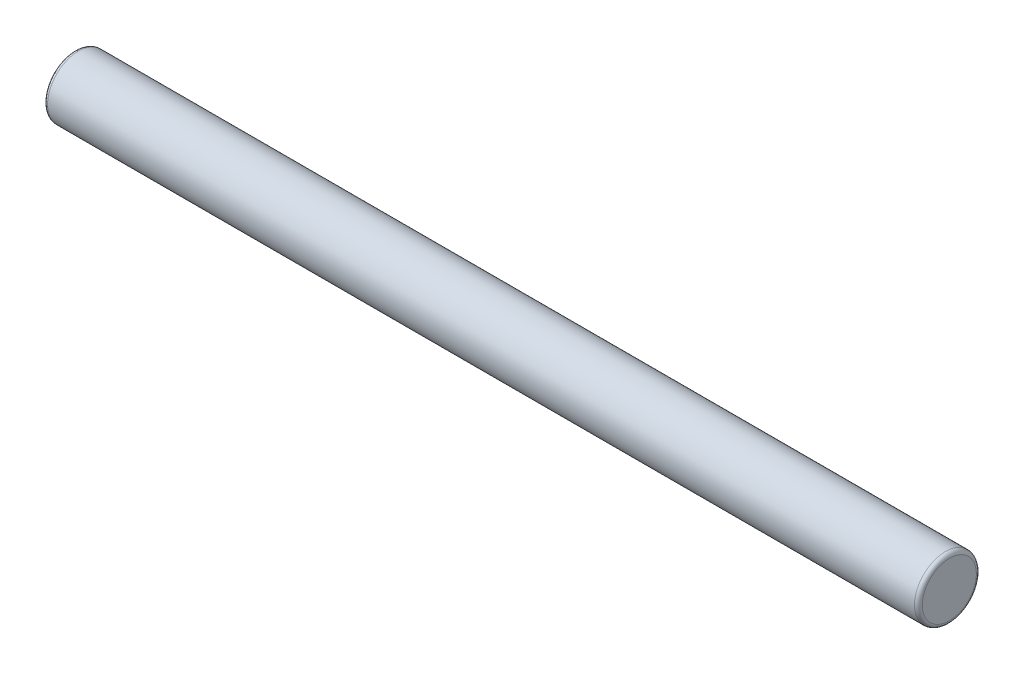
ISO-10303-21;
HEADER;
FILE_DESCRIPTION(('STEP AP214'),'2;1');
FILE_NAME('part.step','',(''),(''),'','','');
FILE_SCHEMA(('AUTOMOTIVE_DESIGN { 1 0 10303 214 1 1 1 1 }'));
ENDSEC;
DATA;
#1=APPLICATION_CONTEXT('core data for automotive mechanical design processes');
#2=APPLICATION_PROTOCOL_DEFINITION('international standard','automotive_design',2000,#1);
#3=PRODUCT_CONTEXT('',#1,'mechanical');
#4=PRODUCT('Part','Part','',(#3));
#5=PRODUCT_RELATED_PRODUCT_CATEGORY('part','',(#4));
#6=PRODUCT_DEFINITION_FORMATION('','',#4);
#7=PRODUCT_DEFINITION_CONTEXT('part definition',#1,'design');
#8=PRODUCT_DEFINITION('design','',#6,#7);
#9=PRODUCT_DEFINITION_SHAPE('','',#8);
#10=(LENGTH_UNIT() NAMED_UNIT(*) SI_UNIT(.MILLI.,.METRE.));
#11=(NAMED_UNIT(*) PLANE_ANGLE_UNIT() SI_UNIT($,.RADIAN.));
#12=(NAMED_UNIT(*) SI_UNIT($,.STERADIAN.) SOLID_ANGLE_UNIT());
#13=UNCERTAINTY_MEASURE_WITH_UNIT(LENGTH_MEASURE(1.E-05),#10,'distance_accuracy_value','');
#14=(GEOMETRIC_REPRESENTATION_CONTEXT(3) GLOBAL_UNCERTAINTY_ASSIGNED_CONTEXT((#13)) GLOBAL_UNIT_ASSIGNED_CONTEXT((#10,
#11,#12)) REPRESENTATION_CONTEXT('',''));
#15=CARTESIAN_POINT('',(0.,0.,0.));
#16=DIRECTION('',(0.,0.,1.));
#17=DIRECTION('',(1.,0.,0.));
#18=AXIS2_PLACEMENT_3D('',#15,#16,#17);
#19=CARTESIAN_POINT('',(113.,0.,0.));
#20=DIRECTION('',(-1.,0.,0.));
#21=DIRECTION('',(0.,0.,1.));
#22=AXIS2_PLACEMENT_3D('',#19,#20,#21);
#23=CYLINDRICAL_SURFACE('',#22,4.);
#24=CARTESIAN_POINT('',(112.492,0.,0.));
#25=DIRECTION('',(1.,0.,0.));
#26=DIRECTION('',(0.,0.,-1.));
#27=AXIS2_PLACEMENT_3D('',#24,#25,#26);
#28=CIRCLE('',#27,4.);
#29=CARTESIAN_POINT('',(112.492,0.,-4.));
#30=VERTEX_POINT('',#29);
#31=EDGE_CURVE('E38',#30,#30,#28,.F.);
#32=ORIENTED_EDGE('',*,*,#31,.T.);
#33=EDGE_LOOP('',(#32));
#34=FACE_BOUND('',#33,.T.);
#35=CARTESIAN_POINT('',(0.507999999999995,0.,0.));
#36=DIRECTION('',(1.,0.,0.));
#37=DIRECTION('',(0.,0.,-1.));
#38=AXIS2_PLACEMENT_3D('',#35,#36,#37);
#39=CIRCLE('',#38,4.);
#40=CARTESIAN_POINT('',(0.507999999999995,0.,-4.));
#41=VERTEX_POINT('',#40);
#42=EDGE_CURVE('E42',#41,#41,#39,.T.);
#43=ORIENTED_EDGE('',*,*,#42,.T.);
#44=EDGE_LOOP('',(#43));
#45=FACE_BOUND('',#44,.T.);
#46=ADVANCED_FACE('F31',(#34,#45),#23,.T.);
#47=CARTESIAN_POINT('',(113.,0.,0.));
#48=DIRECTION('',(1.,0.,0.));
#49=DIRECTION('',(0.,0.,-1.));
#50=AXIS2_PLACEMENT_3D('',#47,#48,#49);
#51=PLANE('',#50);
#52=CARTESIAN_POINT('',(113.,0.,0.));
#53=DIRECTION('',(1.,0.,0.));
#54=DIRECTION('',(0.,0.,-1.));
#55=AXIS2_PLACEMENT_3D('',#52,#53,#54);
#56=CIRCLE('',#55,3.492);
#57=CARTESIAN_POINT('',(113.,0.,-3.492));
#58=VERTEX_POINT('',#57);
#59=EDGE_CURVE('E46',#58,#58,#56,.T.);
#60=ORIENTED_EDGE('',*,*,#59,.T.);
#61=EDGE_LOOP('',(#60));
#62=FACE_BOUND('',#61,.T.);
#63=ADVANCED_FACE('F52',(#62),#51,.T.);
#64=CARTESIAN_POINT('',(0.,0.,0.));
#65=DIRECTION('',(1.,0.,0.));
#66=DIRECTION('',(0.,0.,-1.));
#67=AXIS2_PLACEMENT_3D('',#64,#65,#66);
#68=PLANE('',#67);
#69=CARTESIAN_POINT('',(0.,0.,0.));
#70=DIRECTION('',(1.,0.,0.));
#71=DIRECTION('',(0.,0.,-1.));
#72=AXIS2_PLACEMENT_3D('',#69,#70,#71);
#73=CIRCLE('',#72,3.492);
#74=CARTESIAN_POINT('',(0.,0.,-3.492));
#75=VERTEX_POINT('',#74);
#76=EDGE_CURVE('E10',#75,#75,#73,.F.);
#77=ORIENTED_EDGE('',*,*,#76,.T.);
#78=EDGE_LOOP('',(#77));
#79=FACE_BOUND('',#78,.T.);
#80=ADVANCED_FACE('F56',(#79),#68,.F.);
#81=CARTESIAN_POINT('',(112.492,0.,0.));
#82=DIRECTION('',(1.,0.,0.));
#83=DIRECTION('',(0.,0.,-1.));
#84=AXIS2_PLACEMENT_3D('',#81,#82,#83);
#85=TOROIDAL_SURFACE('',#84,3.492,0.508);
#86=ORIENTED_EDGE('',*,*,#31,.F.);
#87=EDGE_LOOP('',(#86));
#88=FACE_BOUND('',#87,.T.);
#89=ORIENTED_EDGE('',*,*,#59,.F.);
#90=EDGE_LOOP('',(#89));
#91=FACE_BOUND('',#90,.T.);
#92=ADVANCED_FACE('F54',(#88,#91),#85,.T.);
#93=CARTESIAN_POINT('',(0.507999999999995,0.,0.));
#94=DIRECTION('',(1.,0.,0.));
#95=DIRECTION('',(0.,0.,-1.));
#96=AXIS2_PLACEMENT_3D('',#93,#94,#95);
#97=TOROIDAL_SURFACE('',#96,3.492,0.508);
#98=ORIENTED_EDGE('',*,*,#76,.F.);
#99=EDGE_LOOP('',(#98));
#100=FACE_BOUND('',#99,.T.);
#101=ORIENTED_EDGE('',*,*,#42,.F.);
#102=EDGE_LOOP('',(#101));
#103=FACE_BOUND('',#102,.T.);
#104=ADVANCED_FACE('F33',(#100,#103),#97,.T.);
#105=CLOSED_SHELL('',(#46,#63,#80,#92,#104));
#106=MANIFOLD_SOLID_BREP('B2',#105);
#107=ADVANCED_BREP_SHAPE_REPRESENTATION('',(#18,#106),#14);
#108=SHAPE_DEFINITION_REPRESENTATION(#9,#107);
ENDSEC;
END-ISO-10303-21;
